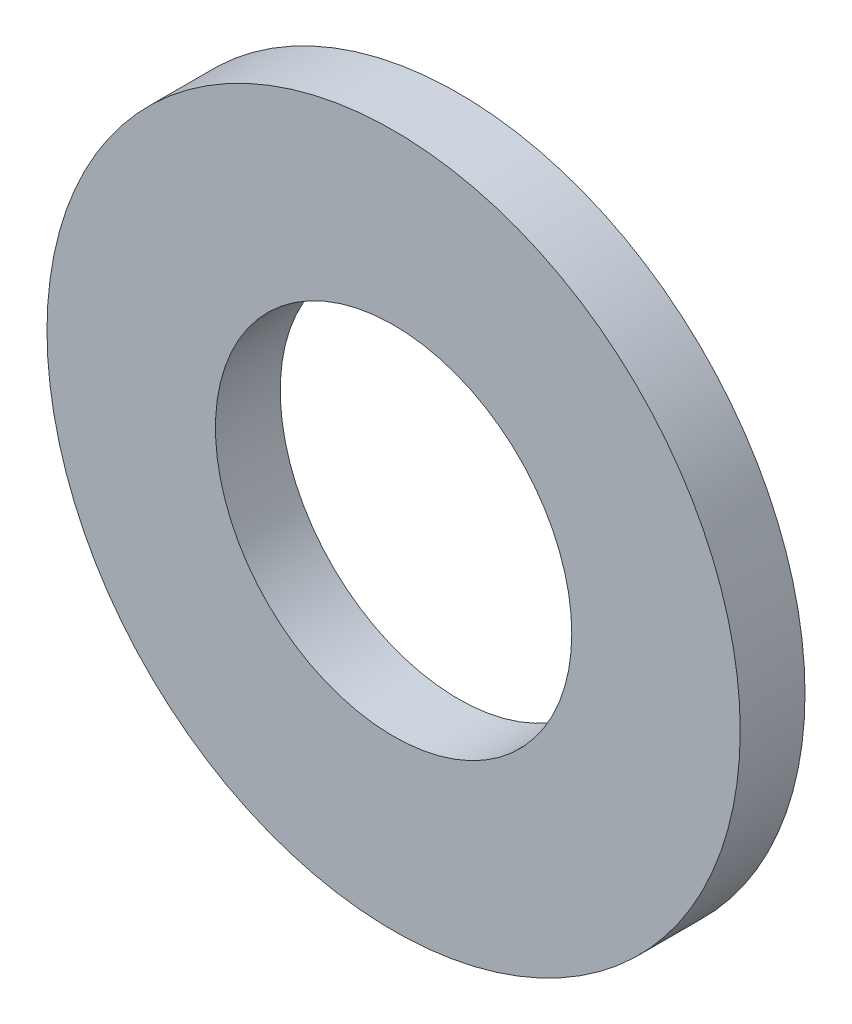
ISO-10303-21;
HEADER;
FILE_DESCRIPTION(('STEP AP214'),'2;1');
FILE_NAME('part.step','',(''),(''),'','','');
FILE_SCHEMA(('AUTOMOTIVE_DESIGN { 1 0 10303 214 1 1 1 1 }'));
ENDSEC;
DATA;
#1=APPLICATION_CONTEXT('core data for automotive mechanical design processes');
#2=APPLICATION_PROTOCOL_DEFINITION('international standard','automotive_design',2000,#1);
#3=PRODUCT_CONTEXT('',#1,'mechanical');
#4=PRODUCT('Part','Part','',(#3));
#5=PRODUCT_RELATED_PRODUCT_CATEGORY('part','',(#4));
#6=PRODUCT_DEFINITION_FORMATION('','',#4);
#7=PRODUCT_DEFINITION_CONTEXT('part definition',#1,'design');
#8=PRODUCT_DEFINITION('design','',#6,#7);
#9=PRODUCT_DEFINITION_SHAPE('','',#8);
#10=(LENGTH_UNIT() NAMED_UNIT(*) SI_UNIT(.MILLI.,.METRE.));
#11=(NAMED_UNIT(*) PLANE_ANGLE_UNIT() SI_UNIT($,.RADIAN.));
#12=(NAMED_UNIT(*) SI_UNIT($,.STERADIAN.) SOLID_ANGLE_UNIT());
#13=UNCERTAINTY_MEASURE_WITH_UNIT(LENGTH_MEASURE(1.E-05),#10,'distance_accuracy_value','');
#14=(GEOMETRIC_REPRESENTATION_CONTEXT(3) GLOBAL_UNCERTAINTY_ASSIGNED_CONTEXT((#13)) GLOBAL_UNIT_ASSIGNED_CONTEXT((#10,
#11,#12)) REPRESENTATION_CONTEXT('',''));
#15=CARTESIAN_POINT('',(0.,0.,0.));
#16=DIRECTION('',(0.,0.,1.));
#17=DIRECTION('',(1.,0.,0.));
#18=AXIS2_PLACEMENT_3D('',#15,#16,#17);
#19=CARTESIAN_POINT('',(0.,0.,1.));
#20=DIRECTION('',(0.,0.,1.));
#21=DIRECTION('',(1.,0.,0.));
#22=AXIS2_PLACEMENT_3D('',#19,#20,#21);
#23=PLANE('',#22);
#24=CARTESIAN_POINT('',(0.,0.,1.));
#25=DIRECTION('',(0.,0.,1.));
#26=DIRECTION('',(1.,0.,0.));
#27=AXIS2_PLACEMENT_3D('',#24,#25,#26);
#28=CIRCLE('',#27,5.35);
#29=CARTESIAN_POINT('',(5.35,0.,1.));
#30=VERTEX_POINT('',#29);
#31=EDGE_CURVE('E10',#30,#30,#28,.T.);
#32=ORIENTED_EDGE('',*,*,#31,.T.);
#33=EDGE_LOOP('',(#32));
#34=FACE_BOUND('',#33,.T.);
#35=CARTESIAN_POINT('',(0.,0.,1.));
#36=DIRECTION('',(0.,0.,1.));
#37=DIRECTION('',(1.,0.,0.));
#38=AXIS2_PLACEMENT_3D('',#35,#36,#37);
#39=CIRCLE('',#38,2.75);
#40=CARTESIAN_POINT('',(2.75,0.,1.));
#41=VERTEX_POINT('',#40);
#42=EDGE_CURVE('E50',#41,#41,#39,.T.);
#43=ORIENTED_EDGE('',*,*,#42,.F.);
#44=EDGE_LOOP('',(#43));
#45=FACE_BOUND('',#44,.T.);
#46=ADVANCED_FACE('F37',(#34,#45),#23,.T.);
#47=CARTESIAN_POINT('',(0.,0.,0.));
#48=DIRECTION('',(0.,0.,1.));
#49=DIRECTION('',(1.,0.,0.));
#50=AXIS2_PLACEMENT_3D('',#47,#48,#49);
#51=PLANE('',#50);
#52=CARTESIAN_POINT('',(0.,0.,0.));
#53=DIRECTION('',(0.,0.,1.));
#54=DIRECTION('',(1.,0.,0.));
#55=AXIS2_PLACEMENT_3D('',#52,#53,#54);
#56=CIRCLE('',#55,5.35);
#57=CARTESIAN_POINT('',(5.35,0.,0.));
#58=VERTEX_POINT('',#57);
#59=EDGE_CURVE('E41',#58,#58,#56,.T.);
#60=ORIENTED_EDGE('',*,*,#59,.F.);
#61=EDGE_LOOP('',(#60));
#62=FACE_BOUND('',#61,.T.);
#63=CARTESIAN_POINT('',(0.,0.,0.));
#64=DIRECTION('',(0.,0.,1.));
#65=DIRECTION('',(1.,0.,0.));
#66=AXIS2_PLACEMENT_3D('',#63,#64,#65);
#67=CIRCLE('',#66,2.75);
#68=CARTESIAN_POINT('',(2.75,0.,0.));
#69=VERTEX_POINT('',#68);
#70=EDGE_CURVE('E52',#69,#69,#67,.T.);
#71=ORIENTED_EDGE('',*,*,#70,.T.);
#72=EDGE_LOOP('',(#71));
#73=FACE_BOUND('',#72,.T.);
#74=ADVANCED_FACE('F64',(#62,#73),#51,.F.);
#75=CARTESIAN_POINT('',(0.,0.,1.));
#76=DIRECTION('',(0.,0.,-1.));
#77=DIRECTION('',(-1.,0.,0.));
#78=AXIS2_PLACEMENT_3D('',#75,#76,#77);
#79=CYLINDRICAL_SURFACE('',#78,5.35);
#80=ORIENTED_EDGE('',*,*,#31,.F.);
#81=EDGE_LOOP('',(#80));
#82=FACE_BOUND('',#81,.T.);
#83=ORIENTED_EDGE('',*,*,#59,.T.);
#84=EDGE_LOOP('',(#83));
#85=FACE_BOUND('',#84,.T.);
#86=ADVANCED_FACE('F39',(#82,#85),#79,.T.);
#87=CARTESIAN_POINT('',(0.,0.,1.));
#88=DIRECTION('',(0.,0.,-1.));
#89=DIRECTION('',(-1.,0.,0.));
#90=AXIS2_PLACEMENT_3D('',#87,#88,#89);
#91=CYLINDRICAL_SURFACE('',#90,2.75);
#92=ORIENTED_EDGE('',*,*,#42,.T.);
#93=EDGE_LOOP('',(#92));
#94=FACE_BOUND('',#93,.T.);
#95=ORIENTED_EDGE('',*,*,#70,.F.);
#96=EDGE_LOOP('',(#95));
#97=FACE_BOUND('',#96,.T.);
#98=ADVANCED_FACE('F60',(#94,#97),#91,.F.);
#99=CLOSED_SHELL('',(#46,#74,#86,#98));
#100=MANIFOLD_SOLID_BREP('B2',#99);
#101=ADVANCED_BREP_SHAPE_REPRESENTATION('',(#18,#100),#14);
#102=SHAPE_DEFINITION_REPRESENTATION(#9,#101);
ENDSEC;
END-ISO-10303-21;
